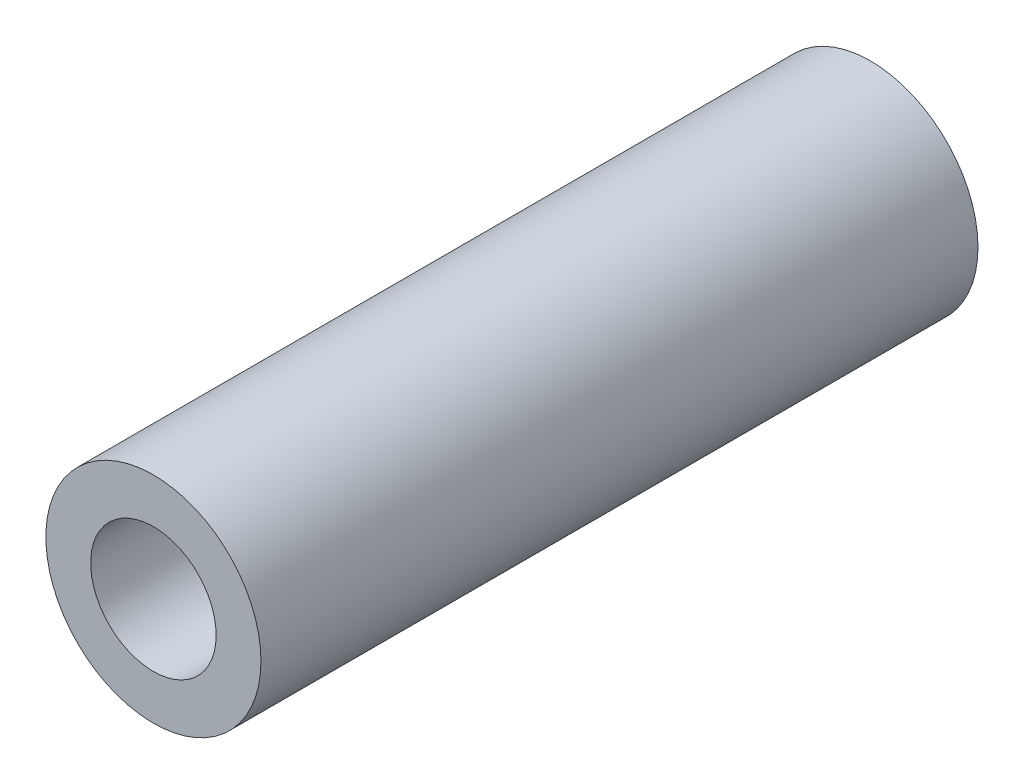
ISO-10303-21;
HEADER;
FILE_DESCRIPTION(('STEP AP214'),'2;1');
FILE_NAME('part.step','',(''),(''),'','','');
FILE_SCHEMA(('AUTOMOTIVE_DESIGN { 1 0 10303 214 1 1 1 1 }'));
ENDSEC;
DATA;
#1=APPLICATION_CONTEXT('core data for automotive mechanical design processes');
#2=APPLICATION_PROTOCOL_DEFINITION('international standard','automotive_design',2000,#1);
#3=PRODUCT_CONTEXT('',#1,'mechanical');
#4=PRODUCT('Part','Part','',(#3));
#5=PRODUCT_RELATED_PRODUCT_CATEGORY('part','',(#4));
#6=PRODUCT_DEFINITION_FORMATION('','',#4);
#7=PRODUCT_DEFINITION_CONTEXT('part definition',#1,'design');
#8=PRODUCT_DEFINITION('design','',#6,#7);
#9=PRODUCT_DEFINITION_SHAPE('','',#8);
#10=(LENGTH_UNIT() NAMED_UNIT(*) SI_UNIT(.MILLI.,.METRE.));
#11=(NAMED_UNIT(*) PLANE_ANGLE_UNIT() SI_UNIT($,.RADIAN.));
#12=(NAMED_UNIT(*) SI_UNIT($,.STERADIAN.) SOLID_ANGLE_UNIT());
#13=UNCERTAINTY_MEASURE_WITH_UNIT(LENGTH_MEASURE(1.E-05),#10,'distance_accuracy_value','');
#14=(GEOMETRIC_REPRESENTATION_CONTEXT(3) GLOBAL_UNCERTAINTY_ASSIGNED_CONTEXT((#13)) GLOBAL_UNIT_ASSIGNED_CONTEXT((#10,
#11,#12)) REPRESENTATION_CONTEXT('',''));
#15=CARTESIAN_POINT('',(0.,0.,0.));
#16=DIRECTION('',(0.,0.,1.));
#17=DIRECTION('',(1.,0.,0.));
#18=AXIS2_PLACEMENT_3D('',#15,#16,#17);
#19=CARTESIAN_POINT('',(0.,0.,10.));
#20=DIRECTION('',(0.,0.,1.));
#21=DIRECTION('',(1.,0.,0.));
#22=AXIS2_PLACEMENT_3D('',#19,#20,#21);
#23=PLANE('',#22);
#24=CARTESIAN_POINT('',(0.,0.,10.));
#25=DIRECTION('',(0.,0.,1.));
#26=DIRECTION('',(1.,0.,0.));
#27=AXIS2_PLACEMENT_3D('',#24,#25,#26);
#28=CIRCLE('',#27,3.);
#29=CARTESIAN_POINT('',(3.,0.,10.));
#30=VERTEX_POINT('',#29);
#31=EDGE_CURVE('E10',#30,#30,#28,.T.);
#32=ORIENTED_EDGE('',*,*,#31,.T.);
#33=EDGE_LOOP('',(#32));
#34=FACE_BOUND('',#33,.T.);
#35=CARTESIAN_POINT('',(0.,0.,10.));
#36=DIRECTION('',(0.,0.,1.));
#37=DIRECTION('',(1.,0.,0.));
#38=AXIS2_PLACEMENT_3D('',#35,#36,#37);
#39=CIRCLE('',#38,1.75);
#40=CARTESIAN_POINT('',(1.75,0.,10.));
#41=VERTEX_POINT('',#40);
#42=EDGE_CURVE('E54',#41,#41,#39,.T.);
#43=ORIENTED_EDGE('',*,*,#42,.F.);
#44=EDGE_LOOP('',(#43));
#45=FACE_BOUND('',#44,.T.);
#46=ADVANCED_FACE('F41',(#34,#45),#23,.T.);
#47=CARTESIAN_POINT('',(0.,0.,-10.));
#48=DIRECTION('',(0.,0.,1.));
#49=DIRECTION('',(1.,0.,0.));
#50=AXIS2_PLACEMENT_3D('',#47,#48,#49);
#51=PLANE('',#50);
#52=CARTESIAN_POINT('',(0.,0.,-10.));
#53=DIRECTION('',(0.,0.,1.));
#54=DIRECTION('',(1.,0.,0.));
#55=AXIS2_PLACEMENT_3D('',#52,#53,#54);
#56=CIRCLE('',#55,3.);
#57=CARTESIAN_POINT('',(3.,0.,-10.));
#58=VERTEX_POINT('',#57);
#59=EDGE_CURVE('E45',#58,#58,#56,.T.);
#60=ORIENTED_EDGE('',*,*,#59,.F.);
#61=EDGE_LOOP('',(#60));
#62=FACE_BOUND('',#61,.T.);
#63=CARTESIAN_POINT('',(0.,0.,-10.));
#64=DIRECTION('',(0.,0.,1.));
#65=DIRECTION('',(1.,0.,0.));
#66=AXIS2_PLACEMENT_3D('',#63,#64,#65);
#67=CIRCLE('',#66,1.75);
#68=CARTESIAN_POINT('',(1.75,0.,-10.));
#69=VERTEX_POINT('',#68);
#70=EDGE_CURVE('E56',#69,#69,#67,.T.);
#71=ORIENTED_EDGE('',*,*,#70,.T.);
#72=EDGE_LOOP('',(#71));
#73=FACE_BOUND('',#72,.T.);
#74=ADVANCED_FACE('F68',(#62,#73),#51,.F.);
#75=CARTESIAN_POINT('',(0.,0.,10.));
#76=DIRECTION('',(0.,0.,-1.));
#77=DIRECTION('',(-1.,0.,0.));
#78=AXIS2_PLACEMENT_3D('',#75,#76,#77);
#79=CYLINDRICAL_SURFACE('',#78,3.);
#80=ORIENTED_EDGE('',*,*,#31,.F.);
#81=EDGE_LOOP('',(#80));
#82=FACE_BOUND('',#81,.T.);
#83=ORIENTED_EDGE('',*,*,#59,.T.);
#84=EDGE_LOOP('',(#83));
#85=FACE_BOUND('',#84,.T.);
#86=ADVANCED_FACE('F43',(#82,#85),#79,.T.);
#87=CARTESIAN_POINT('',(0.,0.,10.));
#88=DIRECTION('',(0.,0.,-1.));
#89=DIRECTION('',(-1.,0.,0.));
#90=AXIS2_PLACEMENT_3D('',#87,#88,#89);
#91=CYLINDRICAL_SURFACE('',#90,1.75);
#92=ORIENTED_EDGE('',*,*,#42,.T.);
#93=EDGE_LOOP('',(#92));
#94=FACE_BOUND('',#93,.T.);
#95=ORIENTED_EDGE('',*,*,#70,.F.);
#96=EDGE_LOOP('',(#95));
#97=FACE_BOUND('',#96,.T.);
#98=ADVANCED_FACE('F64',(#94,#97),#91,.F.);
#99=CLOSED_SHELL('',(#46,#74,#86,#98));
#100=MANIFOLD_SOLID_BREP('B2',#99);
#101=ADVANCED_BREP_SHAPE_REPRESENTATION('',(#18,#100),#14);
#102=SHAPE_DEFINITION_REPRESENTATION(#9,#101);
ENDSEC;
END-ISO-10303-21;
